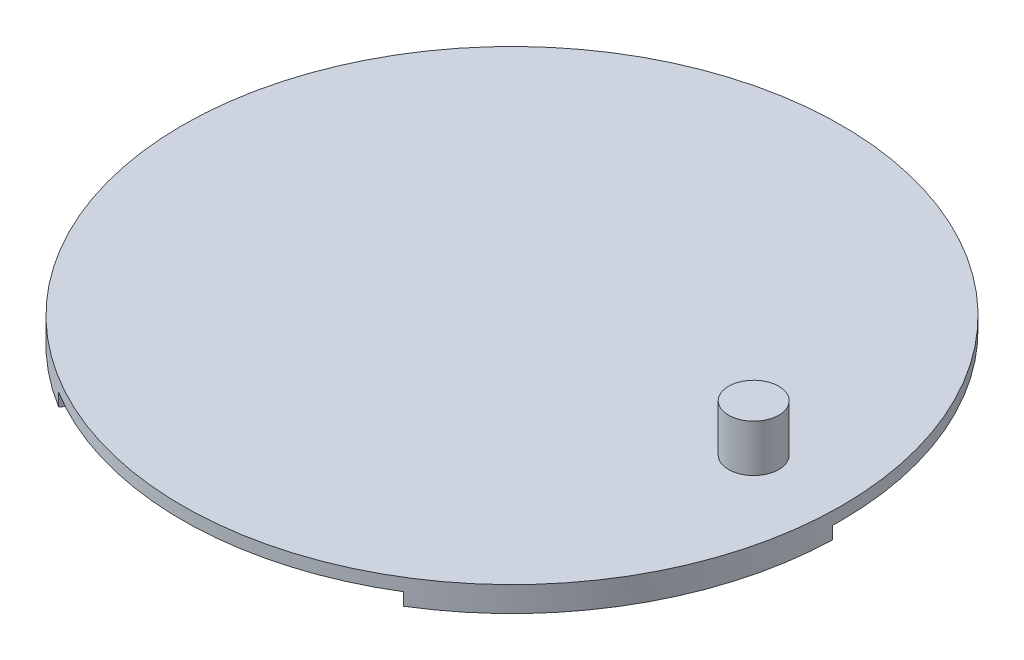
ISO-10303-21;
HEADER;
FILE_DESCRIPTION(('STEP AP214'),'2;1');
FILE_NAME('part.step','',(''),(''),'','','');
FILE_SCHEMA(('AUTOMOTIVE_DESIGN { 1 0 10303 214 1 1 1 1 }'));
ENDSEC;
DATA;
#1=APPLICATION_CONTEXT('core data for automotive mechanical design processes');
#2=APPLICATION_PROTOCOL_DEFINITION('international standard','automotive_design',2000,#1);
#3=PRODUCT_CONTEXT('',#1,'mechanical');
#4=PRODUCT('Part','Part','',(#3));
#5=PRODUCT_RELATED_PRODUCT_CATEGORY('part','',(#4));
#6=PRODUCT_DEFINITION_FORMATION('','',#4);
#7=PRODUCT_DEFINITION_CONTEXT('part definition',#1,'design');
#8=PRODUCT_DEFINITION('design','',#6,#7);
#9=PRODUCT_DEFINITION_SHAPE('','',#8);
#10=(LENGTH_UNIT() NAMED_UNIT(*) SI_UNIT(.MILLI.,.METRE.));
#11=(NAMED_UNIT(*) PLANE_ANGLE_UNIT() SI_UNIT($,.RADIAN.));
#12=(NAMED_UNIT(*) SI_UNIT($,.STERADIAN.) SOLID_ANGLE_UNIT());
#13=UNCERTAINTY_MEASURE_WITH_UNIT(LENGTH_MEASURE(1.E-05),#10,'distance_accuracy_value','');
#14=(GEOMETRIC_REPRESENTATION_CONTEXT(3) GLOBAL_UNCERTAINTY_ASSIGNED_CONTEXT((#13)) GLOBAL_UNIT_ASSIGNED_CONTEXT((#10,
#11,#12)) REPRESENTATION_CONTEXT('',''));
#15=CARTESIAN_POINT('',(0.,0.,0.));
#16=DIRECTION('',(0.,0.,1.));
#17=DIRECTION('',(1.,0.,0.));
#18=AXIS2_PLACEMENT_3D('',#15,#16,#17);
#19=CARTESIAN_POINT('',(0.,4.,0.));
#20=DIRECTION('',(0.,-1.,0.));
#21=DIRECTION('',(1.,0.,0.));
#22=AXIS2_PLACEMENT_3D('',#19,#20,#21);
#23=PLANE('',#22);
#24=CARTESIAN_POINT('',(0.,4.,0.));
#25=DIRECTION('',(0.,1.,0.));
#26=DIRECTION('',(1.,0.,0.));
#27=AXIS2_PLACEMENT_3D('',#24,#25,#26);
#28=CIRCLE('',#27,92.5);
#29=CARTESIAN_POINT('',(45.,4.,-80.8161493762231));
#30=VERTEX_POINT('',#29);
#31=CARTESIAN_POINT('',(-45.,4.,-80.816149376223));
#32=VERTEX_POINT('',#31);
#33=EDGE_CURVE('E54',#30,#32,#28,.T.);
#34=ORIENTED_EDGE('',*,*,#33,.F.);
#35=DIRECTION('',(-0.39829563554714,0.,0.917257099565929));
#36=VECTOR('',#35,1.);
#37=CARTESIAN_POINT('',(45.,4.,-80.816149376223));
#38=LINE('',#37,#36);
#39=CARTESIAN_POINT('',(50.,4.,-92.3309265630969));
#40=VERTEX_POINT('',#39);
#41=EDGE_CURVE('E260',#40,#30,#38,.T.);
#42=ORIENTED_EDGE('',*,*,#41,.F.);
#43=CARTESIAN_POINT('',(0.,4.,0.));
#44=DIRECTION('',(0.,-1.,0.));
#45=DIRECTION('',(1.,0.,0.));
#46=AXIS2_PLACEMENT_3D('',#43,#44,#45);
#47=CIRCLE('',#46,105.);
#48=CARTESIAN_POINT('',(104.960927958597,4.,2.86419309232659));
#49=VERTEX_POINT('',#48);
#50=EDGE_CURVE('E149',#40,#49,#47,.T.);
#51=ORIENTED_EDGE('',*,*,#50,.T.);
#52=DIRECTION('',(-0.993515767799297,0.,-0.11369441118267));
#53=VECTOR('',#52,1.);
#54=CARTESIAN_POINT('',(104.960927958597,4.,2.86419309232657));
#55=LINE('',#54,#53);
#56=CARTESIAN_POINT('',(92.4888383958471,4.,1.43693151781186));
#57=VERTEX_POINT('',#56);
#58=EDGE_CURVE('E192',#49,#57,#55,.T.);
#59=ORIENTED_EDGE('',*,*,#58,.T.);
#60=CARTESIAN_POINT('',(0.,4.,0.));
#61=DIRECTION('',(0.,-1.,0.));
#62=DIRECTION('',(1.,0.,0.));
#63=AXIS2_PLACEMENT_3D('',#60,#61,#62);
#64=CIRCLE('',#63,92.5);
#65=CARTESIAN_POINT('',(47.488838395847,4.,79.3792178584113));
#66=VERTEX_POINT('',#65);
#67=EDGE_CURVE('E182',#57,#66,#64,.T.);
#68=ORIENTED_EDGE('',*,*,#67,.T.);
#69=DIRECTION('',(0.595220132252158,0.,0.803562688383255));
#70=VECTOR('',#69,1.);
#71=CARTESIAN_POINT('',(47.488838395847,4.,79.3792178584113));
#72=LINE('',#71,#70);
#73=CARTESIAN_POINT('',(54.9609279585973,4.,89.4667334707704));
#74=VERTEX_POINT('',#73);
#75=EDGE_CURVE('E185',#66,#74,#72,.T.);
#76=ORIENTED_EDGE('',*,*,#75,.T.);
#77=CARTESIAN_POINT('',(-54.9609279585974,4.,89.4667334707704));
#78=VERTEX_POINT('',#77);
#79=EDGE_CURVE('E189',#74,#78,#47,.T.);
#80=ORIENTED_EDGE('',*,*,#79,.T.);
#81=DIRECTION('',(-0.595220132252158,0.,0.803562688383255));
#82=VECTOR('',#81,1.);
#83=CARTESIAN_POINT('',(-54.9609279585974,4.,89.4667334707704));
#84=LINE('',#83,#82);
#85=CARTESIAN_POINT('',(-47.4888383958471,4.,79.3792178584113));
#86=VERTEX_POINT('',#85);
#87=EDGE_CURVE('E153',#86,#78,#84,.T.);
#88=ORIENTED_EDGE('',*,*,#87,.F.);
#89=CARTESIAN_POINT('',(0.,4.,0.));
#90=DIRECTION('',(0.,1.,0.));
#91=DIRECTION('',(1.,0.,0.));
#92=AXIS2_PLACEMENT_3D('',#89,#90,#91);
#93=CIRCLE('',#92,92.5);
#94=CARTESIAN_POINT('',(-92.4888383958471,4.,1.43693151781175));
#95=VERTEX_POINT('',#94);
#96=EDGE_CURVE('E150',#95,#86,#93,.T.);
#97=ORIENTED_EDGE('',*,*,#96,.F.);
#98=DIRECTION('',(0.993515767799296,0.,-0.113694411182675));
#99=VECTOR('',#98,1.);
#100=CARTESIAN_POINT('',(-92.4888383958471,4.,1.43693151781175));
#101=LINE('',#100,#99);
#102=CARTESIAN_POINT('',(-104.960927958597,4.,2.86419309232653));
#103=VERTEX_POINT('',#102);
#104=EDGE_CURVE('E163',#103,#95,#101,.T.);
#105=ORIENTED_EDGE('',*,*,#104,.F.);
#106=CARTESIAN_POINT('',(-50.,4.,-92.3309265630969));
#107=VERTEX_POINT('',#106);
#108=EDGE_CURVE('E193',#103,#107,#47,.T.);
#109=ORIENTED_EDGE('',*,*,#108,.T.);
#110=DIRECTION('',(-0.398295635547143,0.,-0.917257099565927));
#111=VECTOR('',#110,1.);
#112=CARTESIAN_POINT('',(-50.,4.,-92.3309265630969));
#113=LINE('',#112,#111);
#114=EDGE_CURVE('E59',#32,#107,#113,.T.);
#115=ORIENTED_EDGE('',*,*,#114,.F.);
#116=EDGE_LOOP('',(#34,#42,#51,#59,#68,#76,#80,#88,#97,#105,#109,#115));
#117=FACE_BOUND('',#116,.T.);
#118=ADVANCED_FACE('F39',(#117),#23,.T.);
#119=CARTESIAN_POINT('',(0.,8.,0.));
#120=DIRECTION('',(0.,-1.,0.));
#121=DIRECTION('',(1.,0.,0.));
#122=AXIS2_PLACEMENT_3D('',#119,#120,#121);
#123=CYLINDRICAL_SURFACE('',#122,105.);
#124=DIRECTION('',(0.,-1.,0.));
#125=VECTOR('',#124,1.);
#126=CARTESIAN_POINT('',(104.960927958597,4.,2.86419309232659));
#127=LINE('',#126,#125);
#128=CARTESIAN_POINT('',(104.960927958597,0.,2.86419309232659));
#129=VERTEX_POINT('',#128);
#130=EDGE_CURVE('E205',#49,#129,#127,.T.);
#131=ORIENTED_EDGE('',*,*,#130,.F.);
#132=ORIENTED_EDGE('',*,*,#50,.F.);
#133=DIRECTION('',(0.,1.,0.));
#134=VECTOR('',#133,1.);
#135=CARTESIAN_POINT('',(50.,0.,-92.3309265630969));
#136=LINE('',#135,#134);
#137=CARTESIAN_POINT('',(50.,0.,-92.3309265630969));
#138=VERTEX_POINT('',#137);
#139=EDGE_CURVE('E131',#138,#40,#136,.T.);
#140=ORIENTED_EDGE('',*,*,#139,.F.);
#141=CARTESIAN_POINT('',(0.,0.,0.));
#142=DIRECTION('',(0.,-1.,0.));
#143=DIRECTION('',(-1.,0.,0.));
#144=AXIS2_PLACEMENT_3D('',#141,#142,#143);
#145=CIRCLE('',#144,105.);
#146=CARTESIAN_POINT('',(-50.,0.,-92.3309265630969));
#147=VERTEX_POINT('',#146);
#148=EDGE_CURVE('E137',#147,#138,#145,.T.);
#149=ORIENTED_EDGE('',*,*,#148,.F.);
#150=DIRECTION('',(0.,1.,0.));
#151=VECTOR('',#150,1.);
#152=CARTESIAN_POINT('',(-50.,0.,-92.3309265630969));
#153=LINE('',#152,#151);
#154=EDGE_CURVE('E268',#147,#107,#153,.T.);
#155=ORIENTED_EDGE('',*,*,#154,.T.);
#156=ORIENTED_EDGE('',*,*,#108,.F.);
#157=DIRECTION('',(0.,1.,0.));
#158=VECTOR('',#157,1.);
#159=CARTESIAN_POINT('',(-104.960927958597,0.,2.86419309232653));
#160=LINE('',#159,#158);
#161=CARTESIAN_POINT('',(-104.960927958597,0.,2.86419309232653));
#162=VERTEX_POINT('',#161);
#163=EDGE_CURVE('E174',#162,#103,#160,.T.);
#164=ORIENTED_EDGE('',*,*,#163,.F.);
#165=CARTESIAN_POINT('',(0.,0.,0.));
#166=DIRECTION('',(0.,-1.,0.));
#167=DIRECTION('',(-1.,0.,0.));
#168=AXIS2_PLACEMENT_3D('',#165,#166,#167);
#169=CIRCLE('',#168,105.);
#170=CARTESIAN_POINT('',(-54.9609279585974,0.,89.4667334707704));
#171=VERTEX_POINT('',#170);
#172=EDGE_CURVE('E165',#171,#162,#169,.T.);
#173=ORIENTED_EDGE('',*,*,#172,.F.);
#174=DIRECTION('',(0.,1.,0.));
#175=VECTOR('',#174,1.);
#176=CARTESIAN_POINT('',(-54.9609279585974,0.,89.4667334707704));
#177=LINE('',#176,#175);
#178=EDGE_CURVE('E176',#171,#78,#177,.T.);
#179=ORIENTED_EDGE('',*,*,#178,.T.);
#180=ORIENTED_EDGE('',*,*,#79,.F.);
#181=DIRECTION('',(0.,-1.,0.));
#182=VECTOR('',#181,1.);
#183=CARTESIAN_POINT('',(54.9609279585973,4.,89.4667334707704));
#184=LINE('',#183,#182);
#185=CARTESIAN_POINT('',(54.9609279585973,0.,89.4667334707704));
#186=VERTEX_POINT('',#185);
#187=EDGE_CURVE('E207',#74,#186,#184,.T.);
#188=ORIENTED_EDGE('',*,*,#187,.T.);
#189=CARTESIAN_POINT('',(0.,0.,0.));
#190=DIRECTION('',(0.,-1.,0.));
#191=DIRECTION('',(1.,0.,0.));
#192=AXIS2_PLACEMENT_3D('',#189,#190,#191);
#193=CIRCLE('',#192,105.);
#194=EDGE_CURVE('E204',#129,#186,#193,.T.);
#195=ORIENTED_EDGE('',*,*,#194,.F.);
#196=EDGE_LOOP('',(#131,#132,#140,#149,#155,#156,#164,#173,#179,#180,#188,#195));
#197=FACE_BOUND('',#196,.T.);
#198=CARTESIAN_POINT('',(0.,8.,0.));
#199=DIRECTION('',(0.,-1.,0.));
#200=DIRECTION('',(1.,0.,0.));
#201=AXIS2_PLACEMENT_3D('',#198,#199,#200);
#202=CIRCLE('',#201,105.);
#203=CARTESIAN_POINT('',(105.,8.,0.));
#204=VERTEX_POINT('',#203);
#205=EDGE_CURVE('E47',#204,#204,#202,.T.);
#206=ORIENTED_EDGE('',*,*,#205,.T.);
#207=EDGE_LOOP('',(#206));
#208=FACE_BOUND('',#207,.T.);
#209=ADVANCED_FACE('F41',(#197,#208),#123,.T.);
#210=CARTESIAN_POINT('',(105.,8.,0.));
#211=DIRECTION('',(0.,1.,0.));
#212=DIRECTION('',(-1.,0.,0.));
#213=AXIS2_PLACEMENT_3D('',#210,#211,#212);
#214=PLANE('',#213);
#215=CARTESIAN_POINT('',(77.,8.,0.));
#216=DIRECTION('',(0.,1.,0.));
#217=DIRECTION('',(-1.,0.,0.));
#218=AXIS2_PLACEMENT_3D('',#215,#216,#217);
#219=CIRCLE('',#218,7.99999999999999);
#220=CARTESIAN_POINT('',(69.,8.,0.));
#221=VERTEX_POINT('',#220);
#222=EDGE_CURVE('E11',#221,#221,#219,.T.);
#223=ORIENTED_EDGE('',*,*,#222,.F.);
#224=EDGE_LOOP('',(#223));
#225=FACE_BOUND('',#224,.T.);
#226=ORIENTED_EDGE('',*,*,#205,.F.);
#227=EDGE_LOOP('',(#226));
#228=FACE_BOUND('',#227,.T.);
#229=ADVANCED_FACE('F216',(#225,#228),#214,.T.);
#230=CARTESIAN_POINT('',(0.,0.,0.));
#231=DIRECTION('',(0.,-1.,0.));
#232=DIRECTION('',(1.,0.,0.));
#233=AXIS2_PLACEMENT_3D('',#230,#231,#232);
#234=PLANE('',#233);
#235=DIRECTION('',(-0.993515767799297,0.,-0.11369441118267));
#236=VECTOR('',#235,1.);
#237=CARTESIAN_POINT('',(104.960927958597,0.,2.86419309232657));
#238=LINE('',#237,#236);
#239=CARTESIAN_POINT('',(92.4888383958471,0.,1.43693151781186));
#240=VERTEX_POINT('',#239);
#241=EDGE_CURVE('E186',#129,#240,#238,.T.);
#242=ORIENTED_EDGE('',*,*,#241,.F.);
#243=ORIENTED_EDGE('',*,*,#194,.T.);
#244=DIRECTION('',(0.595220132252158,0.,0.803562688383255));
#245=VECTOR('',#244,1.);
#246=CARTESIAN_POINT('',(47.488838395847,0.,79.3792178584113));
#247=LINE('',#246,#245);
#248=CARTESIAN_POINT('',(47.488838395847,0.,79.3792178584113));
#249=VERTEX_POINT('',#248);
#250=EDGE_CURVE('E198',#249,#186,#247,.T.);
#251=ORIENTED_EDGE('',*,*,#250,.F.);
#252=CARTESIAN_POINT('',(0.,0.,0.));
#253=DIRECTION('',(0.,-1.,0.));
#254=DIRECTION('',(1.,0.,0.));
#255=AXIS2_PLACEMENT_3D('',#252,#253,#254);
#256=CIRCLE('',#255,92.5);
#257=EDGE_CURVE('E181',#240,#249,#256,.T.);
#258=ORIENTED_EDGE('',*,*,#257,.F.);
#259=EDGE_LOOP('',(#242,#243,#251,#258));
#260=FACE_BOUND('',#259,.T.);
#261=ADVANCED_FACE('F218',(#260),#234,.T.);
#262=CARTESIAN_POINT('',(0.,4.,0.));
#263=DIRECTION('',(0.,-1.,0.));
#264=DIRECTION('',(1.,0.,0.));
#265=AXIS2_PLACEMENT_3D('',#262,#263,#264);
#266=CYLINDRICAL_SURFACE('',#265,92.5);
#267=ORIENTED_EDGE('',*,*,#257,.T.);
#268=DIRECTION('',(0.,-1.,0.));
#269=VECTOR('',#268,1.);
#270=CARTESIAN_POINT('',(47.488838395847,4.,79.3792178584113));
#271=LINE('',#270,#269);
#272=EDGE_CURVE('E196',#66,#249,#271,.T.);
#273=ORIENTED_EDGE('',*,*,#272,.F.);
#274=ORIENTED_EDGE('',*,*,#67,.F.);
#275=DIRECTION('',(0.,-1.,0.));
#276=VECTOR('',#275,1.);
#277=CARTESIAN_POINT('',(92.4888383958471,4.,1.43693151781186));
#278=LINE('',#277,#276);
#279=EDGE_CURVE('E202',#57,#240,#278,.T.);
#280=ORIENTED_EDGE('',*,*,#279,.T.);
#281=EDGE_LOOP('',(#267,#273,#274,#280));
#282=FACE_BOUND('',#281,.T.);
#283=ADVANCED_FACE('F225',(#282),#266,.F.);
#284=CARTESIAN_POINT('',(104.960927958597,4.,2.86419309232657));
#285=DIRECTION('',(-0.11369441118267,0.,0.993515767799297));
#286=DIRECTION('',(0.993515767799297,0.,0.11369441118267));
#287=AXIS2_PLACEMENT_3D('',#284,#285,#286);
#288=PLANE('',#287);
#289=ORIENTED_EDGE('',*,*,#241,.T.);
#290=ORIENTED_EDGE('',*,*,#279,.F.);
#291=ORIENTED_EDGE('',*,*,#58,.F.);
#292=ORIENTED_EDGE('',*,*,#130,.T.);
#293=EDGE_LOOP('',(#289,#290,#291,#292));
#294=FACE_BOUND('',#293,.T.);
#295=ADVANCED_FACE('F239',(#294),#288,.F.);
#296=CARTESIAN_POINT('',(47.488838395847,4.,79.3792178584113));
#297=DIRECTION('',(0.803562688383255,0.,-0.595220132252158));
#298=DIRECTION('',(-0.595220132252158,0.,-0.803562688383255));
#299=AXIS2_PLACEMENT_3D('',#296,#297,#298);
#300=PLANE('',#299);
#301=ORIENTED_EDGE('',*,*,#250,.T.);
#302=ORIENTED_EDGE('',*,*,#187,.F.);
#303=ORIENTED_EDGE('',*,*,#75,.F.);
#304=ORIENTED_EDGE('',*,*,#272,.T.);
#305=EDGE_LOOP('',(#301,#302,#303,#304));
#306=FACE_BOUND('',#305,.T.);
#307=ADVANCED_FACE('F242',(#306),#300,.F.);
#308=CARTESIAN_POINT('',(0.,0.,0.));
#309=DIRECTION('',(0.,1.,0.));
#310=DIRECTION('',(-1.,0.,0.));
#311=AXIS2_PLACEMENT_3D('',#308,#309,#310);
#312=CYLINDRICAL_SURFACE('',#311,92.5);
#313=ORIENTED_EDGE('',*,*,#96,.T.);
#314=DIRECTION('',(0.,1.,0.));
#315=VECTOR('',#314,1.);
#316=CARTESIAN_POINT('',(-47.4888383958471,0.,79.3792178584113));
#317=LINE('',#316,#315);
#318=CARTESIAN_POINT('',(-47.4888383958471,0.,79.3792178584113));
#319=VERTEX_POINT('',#318);
#320=EDGE_CURVE('E179',#319,#86,#317,.T.);
#321=ORIENTED_EDGE('',*,*,#320,.F.);
#322=CARTESIAN_POINT('',(0.,0.,0.));
#323=DIRECTION('',(0.,1.,0.));
#324=DIRECTION('',(1.,0.,0.));
#325=AXIS2_PLACEMENT_3D('',#322,#323,#324);
#326=CIRCLE('',#325,92.5);
#327=CARTESIAN_POINT('',(-92.4888383958471,0.,1.43693151781175));
#328=VERTEX_POINT('',#327);
#329=EDGE_CURVE('E159',#328,#319,#326,.T.);
#330=ORIENTED_EDGE('',*,*,#329,.F.);
#331=DIRECTION('',(0.,1.,0.));
#332=VECTOR('',#331,1.);
#333=CARTESIAN_POINT('',(-92.4888383958471,0.,1.43693151781175));
#334=LINE('',#333,#332);
#335=EDGE_CURVE('E168',#328,#95,#334,.T.);
#336=ORIENTED_EDGE('',*,*,#335,.T.);
#337=EDGE_LOOP('',(#313,#321,#330,#336));
#338=FACE_BOUND('',#337,.T.);
#339=ADVANCED_FACE('F237',(#338),#312,.F.);
#340=CARTESIAN_POINT('',(-54.9609279585974,0.,89.4667334707704));
#341=DIRECTION('',(-0.803562688383255,0.,-0.595220132252158));
#342=DIRECTION('',(-0.595220132252158,0.,0.803562688383255));
#343=AXIS2_PLACEMENT_3D('',#340,#341,#342);
#344=PLANE('',#343);
#345=ORIENTED_EDGE('',*,*,#87,.T.);
#346=ORIENTED_EDGE('',*,*,#178,.F.);
#347=DIRECTION('',(-0.595220132252158,0.,0.803562688383255));
#348=VECTOR('',#347,1.);
#349=CARTESIAN_POINT('',(-54.9609279585974,0.,89.4667334707704));
#350=LINE('',#349,#348);
#351=EDGE_CURVE('E162',#319,#171,#350,.T.);
#352=ORIENTED_EDGE('',*,*,#351,.F.);
#353=ORIENTED_EDGE('',*,*,#320,.T.);
#354=EDGE_LOOP('',(#345,#346,#352,#353));
#355=FACE_BOUND('',#354,.T.);
#356=ADVANCED_FACE('F305',(#355),#344,.F.);
#357=CARTESIAN_POINT('',(-92.4888383958471,0.,1.43693151781175));
#358=DIRECTION('',(0.113694411182675,0.,0.993515767799296));
#359=DIRECTION('',(0.993515767799296,0.,-0.113694411182675));
#360=AXIS2_PLACEMENT_3D('',#357,#358,#359);
#361=PLANE('',#360);
#362=ORIENTED_EDGE('',*,*,#104,.T.);
#363=ORIENTED_EDGE('',*,*,#335,.F.);
#364=DIRECTION('',(0.993515767799296,0.,-0.113694411182675));
#365=VECTOR('',#364,1.);
#366=CARTESIAN_POINT('',(-92.4888383958471,0.,1.43693151781175));
#367=LINE('',#366,#365);
#368=EDGE_CURVE('E167',#162,#328,#367,.T.);
#369=ORIENTED_EDGE('',*,*,#368,.F.);
#370=ORIENTED_EDGE('',*,*,#163,.T.);
#371=EDGE_LOOP('',(#362,#363,#369,#370));
#372=FACE_BOUND('',#371,.T.);
#373=ADVANCED_FACE('F302',(#372),#361,.F.);
#374=CARTESIAN_POINT('',(0.,0.,0.));
#375=DIRECTION('',(0.,-1.,0.));
#376=DIRECTION('',(1.,0.,0.));
#377=AXIS2_PLACEMENT_3D('',#374,#375,#376);
#378=PLANE('',#377);
#379=ORIENTED_EDGE('',*,*,#329,.T.);
#380=ORIENTED_EDGE('',*,*,#351,.T.);
#381=ORIENTED_EDGE('',*,*,#172,.T.);
#382=ORIENTED_EDGE('',*,*,#368,.T.);
#383=EDGE_LOOP('',(#379,#380,#381,#382));
#384=FACE_BOUND('',#383,.T.);
#385=ADVANCED_FACE('F300',(#384),#378,.T.);
#386=CARTESIAN_POINT('',(45.,0.,-80.816149376223));
#387=DIRECTION('',(-0.917257099565929,0.,-0.39829563554714));
#388=DIRECTION('',(-0.39829563554714,0.,0.917257099565929));
#389=AXIS2_PLACEMENT_3D('',#386,#387,#388);
#390=PLANE('',#389);
#391=ORIENTED_EDGE('',*,*,#41,.T.);
#392=DIRECTION('',(0.,1.,0.));
#393=VECTOR('',#392,1.);
#394=CARTESIAN_POINT('',(45.,0.,-80.816149376223));
#395=LINE('',#394,#393);
#396=CARTESIAN_POINT('',(45.,0.,-80.816149376223));
#397=VERTEX_POINT('',#396);
#398=EDGE_CURVE('E133',#397,#30,#395,.T.);
#399=ORIENTED_EDGE('',*,*,#398,.F.);
#400=DIRECTION('',(-0.39829563554714,0.,0.917257099565929));
#401=VECTOR('',#400,1.);
#402=CARTESIAN_POINT('',(45.,0.,-80.816149376223));
#403=LINE('',#402,#401);
#404=EDGE_CURVE('E127',#138,#397,#403,.T.);
#405=ORIENTED_EDGE('',*,*,#404,.F.);
#406=ORIENTED_EDGE('',*,*,#139,.T.);
#407=EDGE_LOOP('',(#391,#399,#405,#406));
#408=FACE_BOUND('',#407,.T.);
#409=ADVANCED_FACE('F129',(#408),#390,.F.);
#410=CARTESIAN_POINT('',(0.,0.,0.));
#411=DIRECTION('',(0.,1.,0.));
#412=DIRECTION('',(-1.,0.,0.));
#413=AXIS2_PLACEMENT_3D('',#410,#411,#412);
#414=CYLINDRICAL_SURFACE('',#413,92.5);
#415=ORIENTED_EDGE('',*,*,#33,.T.);
#416=DIRECTION('',(0.,1.,0.));
#417=VECTOR('',#416,1.);
#418=CARTESIAN_POINT('',(-45.,0.,-80.816149376223));
#419=LINE('',#418,#417);
#420=CARTESIAN_POINT('',(-45.,0.,-80.816149376223));
#421=VERTEX_POINT('',#420);
#422=EDGE_CURVE('E155',#421,#32,#419,.T.);
#423=ORIENTED_EDGE('',*,*,#422,.F.);
#424=CARTESIAN_POINT('',(0.,0.,0.));
#425=DIRECTION('',(0.,1.,0.));
#426=DIRECTION('',(1.,0.,0.));
#427=AXIS2_PLACEMENT_3D('',#424,#425,#426);
#428=CIRCLE('',#427,92.5);
#429=EDGE_CURVE('E136',#397,#421,#428,.T.);
#430=ORIENTED_EDGE('',*,*,#429,.F.);
#431=ORIENTED_EDGE('',*,*,#398,.T.);
#432=EDGE_LOOP('',(#415,#423,#430,#431));
#433=FACE_BOUND('',#432,.T.);
#434=ADVANCED_FACE('F294',(#433),#414,.F.);
#435=CARTESIAN_POINT('',(-50.,0.,-92.3309265630969));
#436=DIRECTION('',(0.917257099565927,0.,-0.398295635547143));
#437=DIRECTION('',(-0.398295635547143,0.,-0.917257099565927));
#438=AXIS2_PLACEMENT_3D('',#435,#436,#437);
#439=PLANE('',#438);
#440=ORIENTED_EDGE('',*,*,#114,.T.);
#441=ORIENTED_EDGE('',*,*,#154,.F.);
#442=DIRECTION('',(-0.398295635547143,0.,-0.917257099565927));
#443=VECTOR('',#442,1.);
#444=CARTESIAN_POINT('',(-50.,0.,-92.3309265630969));
#445=LINE('',#444,#443);
#446=EDGE_CURVE('E142',#421,#147,#445,.T.);
#447=ORIENTED_EDGE('',*,*,#446,.F.);
#448=ORIENTED_EDGE('',*,*,#422,.T.);
#449=EDGE_LOOP('',(#440,#441,#447,#448));
#450=FACE_BOUND('',#449,.T.);
#451=ADVANCED_FACE('F267',(#450),#439,.F.);
#452=CARTESIAN_POINT('',(0.,0.,0.));
#453=DIRECTION('',(0.,1.,0.));
#454=DIRECTION('',(-1.,0.,0.));
#455=AXIS2_PLACEMENT_3D('',#452,#453,#454);
#456=PLANE('',#455);
#457=ORIENTED_EDGE('',*,*,#148,.T.);
#458=ORIENTED_EDGE('',*,*,#404,.T.);
#459=ORIENTED_EDGE('',*,*,#429,.T.);
#460=ORIENTED_EDGE('',*,*,#446,.T.);
#461=EDGE_LOOP('',(#457,#458,#459,#460));
#462=FACE_BOUND('',#461,.T.);
#463=ADVANCED_FACE('F140',(#462),#456,.F.);
#464=CARTESIAN_POINT('',(77.,23.,0.));
#465=DIRECTION('',(0.,-1.,0.));
#466=DIRECTION('',(0.,0.,-1.));
#467=AXIS2_PLACEMENT_3D('',#464,#465,#466);
#468=CYLINDRICAL_SURFACE('',#467,7.99999999999999);
#469=CARTESIAN_POINT('',(77.,23.,0.));
#470=DIRECTION('',(0.,-1.,0.));
#471=DIRECTION('',(0.,0.,-1.));
#472=AXIS2_PLACEMENT_3D('',#469,#470,#471);
#473=CIRCLE('',#472,7.99999999999999);
#474=CARTESIAN_POINT('',(77.,23.,-7.99999999999999));
#475=VERTEX_POINT('',#474);
#476=EDGE_CURVE('E275',#475,#475,#473,.T.);
#477=ORIENTED_EDGE('',*,*,#476,.T.);
#478=EDGE_LOOP('',(#477));
#479=FACE_BOUND('',#478,.T.);
#480=ORIENTED_EDGE('',*,*,#222,.T.);
#481=EDGE_LOOP('',(#480));
#482=FACE_BOUND('',#481,.T.);
#483=ADVANCED_FACE('F281',(#479,#482),#468,.T.);
#484=CARTESIAN_POINT('',(85.,23.,0.));
#485=DIRECTION('',(0.,1.,0.));
#486=DIRECTION('',(0.,0.,1.));
#487=AXIS2_PLACEMENT_3D('',#484,#485,#486);
#488=PLANE('',#487);
#489=ORIENTED_EDGE('',*,*,#476,.F.);
#490=EDGE_LOOP('',(#489));
#491=FACE_BOUND('',#490,.T.);
#492=ADVANCED_FACE('F284',(#491),#488,.T.);
#493=CLOSED_SHELL('',(#118,#209,#229,#261,#283,#295,#307,#339,#356,#373,#385,#409,#434,#451,
#463,#483,#492));
#494=MANIFOLD_SOLID_BREP('B2',#493);
#495=ADVANCED_BREP_SHAPE_REPRESENTATION('',(#18,#494),#14);
#496=SHAPE_DEFINITION_REPRESENTATION(#9,#495);
ENDSEC;
END-ISO-10303-21;
